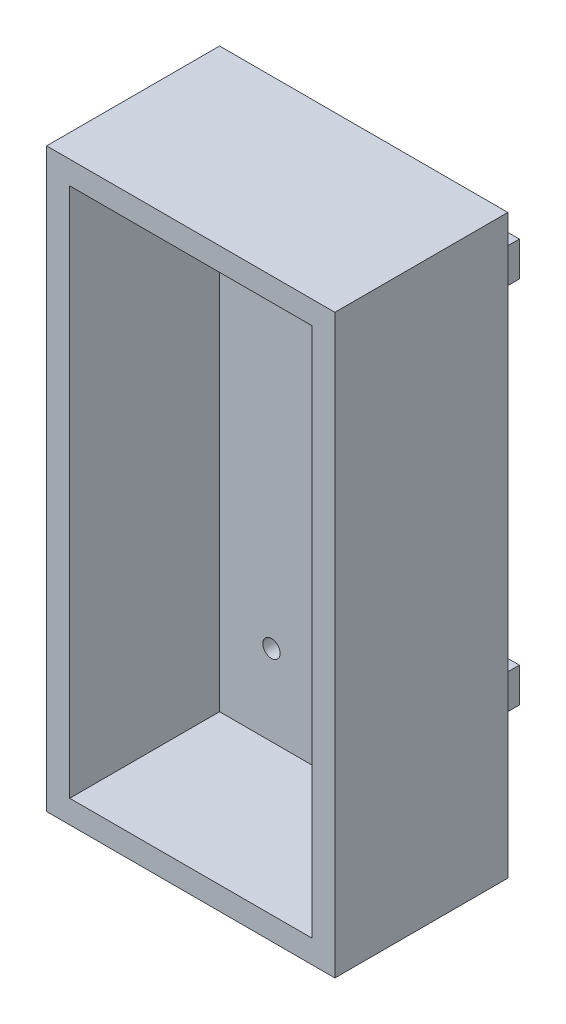
ISO-10303-21;
HEADER;
FILE_DESCRIPTION(('STEP AP214'),'2;1');
FILE_NAME('part.step','',(''),(''),'','','');
FILE_SCHEMA(('AUTOMOTIVE_DESIGN { 1 0 10303 214 1 1 1 1 }'));
ENDSEC;
DATA;
#1=APPLICATION_CONTEXT('core data for automotive mechanical design processes');
#2=APPLICATION_PROTOCOL_DEFINITION('international standard','automotive_design',2000,#1);
#3=PRODUCT_CONTEXT('',#1,'mechanical');
#4=PRODUCT('Part','Part','',(#3));
#5=PRODUCT_RELATED_PRODUCT_CATEGORY('part','',(#4));
#6=PRODUCT_DEFINITION_FORMATION('','',#4);
#7=PRODUCT_DEFINITION_CONTEXT('part definition',#1,'design');
#8=PRODUCT_DEFINITION('design','',#6,#7);
#9=PRODUCT_DEFINITION_SHAPE('','',#8);
#10=(LENGTH_UNIT() NAMED_UNIT(*) SI_UNIT(.MILLI.,.METRE.));
#11=(NAMED_UNIT(*) PLANE_ANGLE_UNIT() SI_UNIT($,.RADIAN.));
#12=(NAMED_UNIT(*) SI_UNIT($,.STERADIAN.) SOLID_ANGLE_UNIT());
#13=UNCERTAINTY_MEASURE_WITH_UNIT(LENGTH_MEASURE(1.E-05),#10,'distance_accuracy_value','');
#14=(GEOMETRIC_REPRESENTATION_CONTEXT(3) GLOBAL_UNCERTAINTY_ASSIGNED_CONTEXT((#13)) GLOBAL_UNIT_ASSIGNED_CONTEXT((#10,
#11,#12)) REPRESENTATION_CONTEXT('',''));
#15=CARTESIAN_POINT('',(0.,0.,0.));
#16=DIRECTION('',(0.,0.,1.));
#17=DIRECTION('',(1.,0.,0.));
#18=AXIS2_PLACEMENT_3D('',#15,#16,#17);
#19=CARTESIAN_POINT('',(0.,0.,0.));
#20=DIRECTION('',(0.,0.,-1.));
#21=DIRECTION('',(-1.,0.,0.));
#22=AXIS2_PLACEMENT_3D('',#19,#20,#21);
#23=PLANE('',#22);
#24=DIRECTION('',(0.,-1.,0.));
#25=VECTOR('',#24,1.);
#26=CARTESIAN_POINT('',(0.,0.,0.));
#27=LINE('',#26,#25);
#28=CARTESIAN_POINT('',(0.,100.,0.));
#29=VERTEX_POINT('',#28);
#30=CARTESIAN_POINT('',(0.,0.,0.));
#31=VERTEX_POINT('',#30);
#32=EDGE_CURVE('E252',#29,#31,#27,.T.);
#33=ORIENTED_EDGE('',*,*,#32,.F.);
#34=DIRECTION('',(-1.,0.,0.));
#35=VECTOR('',#34,1.);
#36=CARTESIAN_POINT('',(0.,100.,0.));
#37=LINE('',#36,#35);
#38=CARTESIAN_POINT('',(50.,100.,0.));
#39=VERTEX_POINT('',#38);
#40=EDGE_CURVE('E263',#39,#29,#37,.T.);
#41=ORIENTED_EDGE('',*,*,#40,.F.);
#42=DIRECTION('',(0.,1.,0.));
#43=VECTOR('',#42,1.);
#44=CARTESIAN_POINT('',(50.,0.,0.));
#45=LINE('',#44,#43);
#46=CARTESIAN_POINT('',(50.,0.,0.));
#47=VERTEX_POINT('',#46);
#48=EDGE_CURVE('E274',#47,#39,#45,.T.);
#49=ORIENTED_EDGE('',*,*,#48,.F.);
#50=DIRECTION('',(1.,0.,0.));
#51=VECTOR('',#50,1.);
#52=CARTESIAN_POINT('',(0.,0.,0.));
#53=LINE('',#52,#51);
#54=EDGE_CURVE('E272',#31,#47,#53,.T.);
#55=ORIENTED_EDGE('',*,*,#54,.F.);
#56=EDGE_LOOP('',(#33,#41,#49,#55));
#57=FACE_BOUND('',#56,.T.);
#58=DIRECTION('',(-1.,0.,0.));
#59=VECTOR('',#58,1.);
#60=CARTESIAN_POINT('',(40.,15.,0.));
#61=LINE('',#60,#59);
#62=CARTESIAN_POINT('',(40.,15.,0.));
#63=VERTEX_POINT('',#62);
#64=CARTESIAN_POINT('',(10.,15.,0.));
#65=VERTEX_POINT('',#64);
#66=EDGE_CURVE('E209',#63,#65,#61,.T.);
#67=ORIENTED_EDGE('',*,*,#66,.F.);
#68=DIRECTION('',(0.,-1.,0.));
#69=VECTOR('',#68,1.);
#70=CARTESIAN_POINT('',(40.,21.,0.));
#71=LINE('',#70,#69);
#72=CARTESIAN_POINT('',(40.,21.,0.));
#73=VERTEX_POINT('',#72);
#74=EDGE_CURVE('E206',#73,#63,#71,.T.);
#75=ORIENTED_EDGE('',*,*,#74,.F.);
#76=DIRECTION('',(1.,0.,0.));
#77=VECTOR('',#76,1.);
#78=CARTESIAN_POINT('',(40.,21.,0.));
#79=LINE('',#78,#77);
#80=CARTESIAN_POINT('',(10.,21.,0.));
#81=VERTEX_POINT('',#80);
#82=EDGE_CURVE('E215',#81,#73,#79,.T.);
#83=ORIENTED_EDGE('',*,*,#82,.F.);
#84=DIRECTION('',(0.,1.,0.));
#85=VECTOR('',#84,1.);
#86=CARTESIAN_POINT('',(10.,21.,0.));
#87=LINE('',#86,#85);
#88=EDGE_CURVE('E212',#65,#81,#87,.T.);
#89=ORIENTED_EDGE('',*,*,#88,.F.);
#90=EDGE_LOOP('',(#67,#75,#83,#89));
#91=FACE_BOUND('',#90,.T.);
#92=DIRECTION('',(-1.,0.,0.));
#93=VECTOR('',#92,1.);
#94=CARTESIAN_POINT('',(40.,79.,0.));
#95=LINE('',#94,#93);
#96=CARTESIAN_POINT('',(40.,79.,0.));
#97=VERTEX_POINT('',#96);
#98=CARTESIAN_POINT('',(10.,79.,0.));
#99=VERTEX_POINT('',#98);
#100=EDGE_CURVE('E306',#97,#99,#95,.T.);
#101=ORIENTED_EDGE('',*,*,#100,.F.);
#102=DIRECTION('',(0.,-1.,0.));
#103=VECTOR('',#102,1.);
#104=CARTESIAN_POINT('',(40.,79.,0.));
#105=LINE('',#104,#103);
#106=CARTESIAN_POINT('',(40.,85.,0.));
#107=VERTEX_POINT('',#106);
#108=EDGE_CURVE('E303',#107,#97,#105,.T.);
#109=ORIENTED_EDGE('',*,*,#108,.F.);
#110=DIRECTION('',(1.,0.,0.));
#111=VECTOR('',#110,1.);
#112=CARTESIAN_POINT('',(40.,85.,0.));
#113=LINE('',#112,#111);
#114=CARTESIAN_POINT('',(10.,85.,0.));
#115=VERTEX_POINT('',#114);
#116=EDGE_CURVE('E201',#115,#107,#113,.T.);
#117=ORIENTED_EDGE('',*,*,#116,.F.);
#118=DIRECTION('',(0.,1.,0.));
#119=VECTOR('',#118,1.);
#120=CARTESIAN_POINT('',(10.,79.,0.));
#121=LINE('',#120,#119);
#122=EDGE_CURVE('E194',#99,#115,#121,.T.);
#123=ORIENTED_EDGE('',*,*,#122,.F.);
#124=EDGE_LOOP('',(#101,#109,#117,#123));
#125=FACE_BOUND('',#124,.T.);
#126=ADVANCED_FACE('F33',(#57,#91,#125),#23,.T.);
#127=CARTESIAN_POINT('',(0.,0.,30.));
#128=DIRECTION('',(1.,0.,0.));
#129=DIRECTION('',(0.,0.,-1.));
#130=AXIS2_PLACEMENT_3D('',#127,#128,#129);
#131=PLANE('',#130);
#132=ORIENTED_EDGE('',*,*,#32,.T.);
#133=DIRECTION('',(0.,0.,-1.));
#134=VECTOR('',#133,1.);
#135=CARTESIAN_POINT('',(0.,0.,30.));
#136=LINE('',#135,#134);
#137=CARTESIAN_POINT('',(0.,0.,30.));
#138=VERTEX_POINT('',#137);
#139=EDGE_CURVE('E11',#138,#31,#136,.T.);
#140=ORIENTED_EDGE('',*,*,#139,.F.);
#141=DIRECTION('',(0.,-1.,0.));
#142=VECTOR('',#141,1.);
#143=CARTESIAN_POINT('',(0.,0.,30.));
#144=LINE('',#143,#142);
#145=CARTESIAN_POINT('',(0.,100.,30.));
#146=VERTEX_POINT('',#145);
#147=EDGE_CURVE('E259',#146,#138,#144,.T.);
#148=ORIENTED_EDGE('',*,*,#147,.F.);
#149=DIRECTION('',(0.,0.,-1.));
#150=VECTOR('',#149,1.);
#151=CARTESIAN_POINT('',(0.,100.,30.));
#152=LINE('',#151,#150);
#153=EDGE_CURVE('E269',#146,#29,#152,.T.);
#154=ORIENTED_EDGE('',*,*,#153,.T.);
#155=EDGE_LOOP('',(#132,#140,#148,#154));
#156=FACE_BOUND('',#155,.T.);
#157=ADVANCED_FACE('F35',(#156),#131,.F.);
#158=CARTESIAN_POINT('',(0.,0.,30.));
#159=DIRECTION('',(0.,1.,0.));
#160=DIRECTION('',(0.,0.,1.));
#161=AXIS2_PLACEMENT_3D('',#158,#159,#160);
#162=PLANE('',#161);
#163=ORIENTED_EDGE('',*,*,#54,.T.);
#164=DIRECTION('',(0.,0.,-1.));
#165=VECTOR('',#164,1.);
#166=CARTESIAN_POINT('',(50.,0.,30.));
#167=LINE('',#166,#165);
#168=CARTESIAN_POINT('',(50.,0.,30.));
#169=VERTEX_POINT('',#168);
#170=EDGE_CURVE('E42',#169,#47,#167,.T.);
#171=ORIENTED_EDGE('',*,*,#170,.F.);
#172=DIRECTION('',(1.,0.,0.));
#173=VECTOR('',#172,1.);
#174=CARTESIAN_POINT('',(0.,0.,30.));
#175=LINE('',#174,#173);
#176=EDGE_CURVE('E262',#138,#169,#175,.T.);
#177=ORIENTED_EDGE('',*,*,#176,.F.);
#178=ORIENTED_EDGE('',*,*,#139,.T.);
#179=EDGE_LOOP('',(#163,#171,#177,#178));
#180=FACE_BOUND('',#179,.T.);
#181=ADVANCED_FACE('F379',(#180),#162,.F.);
#182=CARTESIAN_POINT('',(50.,0.,30.));
#183=DIRECTION('',(-1.,0.,0.));
#184=DIRECTION('',(0.,0.,1.));
#185=AXIS2_PLACEMENT_3D('',#182,#183,#184);
#186=PLANE('',#185);
#187=ORIENTED_EDGE('',*,*,#48,.T.);
#188=DIRECTION('',(0.,0.,-1.));
#189=VECTOR('',#188,1.);
#190=CARTESIAN_POINT('',(50.,100.,30.));
#191=LINE('',#190,#189);
#192=CARTESIAN_POINT('',(50.,100.,30.));
#193=VERTEX_POINT('',#192);
#194=EDGE_CURVE('E279',#193,#39,#191,.T.);
#195=ORIENTED_EDGE('',*,*,#194,.F.);
#196=DIRECTION('',(0.,1.,0.));
#197=VECTOR('',#196,1.);
#198=CARTESIAN_POINT('',(50.,0.,30.));
#199=LINE('',#198,#197);
#200=EDGE_CURVE('E265',#169,#193,#199,.T.);
#201=ORIENTED_EDGE('',*,*,#200,.F.);
#202=ORIENTED_EDGE('',*,*,#170,.T.);
#203=EDGE_LOOP('',(#187,#195,#201,#202));
#204=FACE_BOUND('',#203,.T.);
#205=ADVANCED_FACE('F390',(#204),#186,.F.);
#206=CARTESIAN_POINT('',(0.,100.,30.));
#207=DIRECTION('',(0.,-1.,0.));
#208=DIRECTION('',(0.,0.,-1.));
#209=AXIS2_PLACEMENT_3D('',#206,#207,#208);
#210=PLANE('',#209);
#211=ORIENTED_EDGE('',*,*,#40,.T.);
#212=ORIENTED_EDGE('',*,*,#153,.F.);
#213=DIRECTION('',(-1.,0.,0.));
#214=VECTOR('',#213,1.);
#215=CARTESIAN_POINT('',(0.,100.,30.));
#216=LINE('',#215,#214);
#217=EDGE_CURVE('E267',#193,#146,#216,.T.);
#218=ORIENTED_EDGE('',*,*,#217,.F.);
#219=ORIENTED_EDGE('',*,*,#194,.T.);
#220=EDGE_LOOP('',(#211,#212,#218,#219));
#221=FACE_BOUND('',#220,.T.);
#222=ADVANCED_FACE('F387',(#221),#210,.F.);
#223=CARTESIAN_POINT('',(0.,0.,30.));
#224=DIRECTION('',(0.,0.,-1.));
#225=DIRECTION('',(-1.,0.,0.));
#226=AXIS2_PLACEMENT_3D('',#223,#224,#225);
#227=PLANE('',#226);
#228=DIRECTION('',(1.,0.,0.));
#229=VECTOR('',#228,1.);
#230=CARTESIAN_POINT('',(4.,4.,30.));
#231=LINE('',#230,#229);
#232=CARTESIAN_POINT('',(4.,4.,30.));
#233=VERTEX_POINT('',#232);
#234=CARTESIAN_POINT('',(46.,4.,30.));
#235=VERTEX_POINT('',#234);
#236=EDGE_CURVE('E242',#233,#235,#231,.T.);
#237=ORIENTED_EDGE('',*,*,#236,.F.);
#238=DIRECTION('',(0.,-1.,0.));
#239=VECTOR('',#238,1.);
#240=CARTESIAN_POINT('',(4.,4.,30.));
#241=LINE('',#240,#239);
#242=CARTESIAN_POINT('',(4.,96.,30.));
#243=VERTEX_POINT('',#242);
#244=EDGE_CURVE('E226',#243,#233,#241,.T.);
#245=ORIENTED_EDGE('',*,*,#244,.F.);
#246=DIRECTION('',(-1.,0.,0.));
#247=VECTOR('',#246,1.);
#248=CARTESIAN_POINT('',(4.,96.,30.));
#249=LINE('',#248,#247);
#250=CARTESIAN_POINT('',(46.,96.,30.));
#251=VERTEX_POINT('',#250);
#252=EDGE_CURVE('E231',#251,#243,#249,.T.);
#253=ORIENTED_EDGE('',*,*,#252,.F.);
#254=DIRECTION('',(0.,1.,0.));
#255=VECTOR('',#254,1.);
#256=CARTESIAN_POINT('',(46.,4.,30.));
#257=LINE('',#256,#255);
#258=EDGE_CURVE('E245',#235,#251,#257,.T.);
#259=ORIENTED_EDGE('',*,*,#258,.F.);
#260=EDGE_LOOP('',(#237,#245,#253,#259));
#261=FACE_BOUND('',#260,.T.);
#262=ORIENTED_EDGE('',*,*,#147,.T.);
#263=ORIENTED_EDGE('',*,*,#176,.T.);
#264=ORIENTED_EDGE('',*,*,#200,.T.);
#265=ORIENTED_EDGE('',*,*,#217,.T.);
#266=EDGE_LOOP('',(#262,#263,#264,#265));
#267=FACE_BOUND('',#266,.T.);
#268=ADVANCED_FACE('F385',(#261,#267),#227,.F.);
#269=CARTESIAN_POINT('',(4.,4.,4.));
#270=DIRECTION('',(-1.,0.,0.));
#271=DIRECTION('',(0.,0.,1.));
#272=AXIS2_PLACEMENT_3D('',#269,#270,#271);
#273=PLANE('',#272);
#274=ORIENTED_EDGE('',*,*,#244,.T.);
#275=DIRECTION('',(0.,0.,1.));
#276=VECTOR('',#275,1.);
#277=CARTESIAN_POINT('',(4.,4.,4.));
#278=LINE('',#277,#276);
#279=CARTESIAN_POINT('',(4.,4.,4.));
#280=VERTEX_POINT('',#279);
#281=EDGE_CURVE('E240',#280,#233,#278,.T.);
#282=ORIENTED_EDGE('',*,*,#281,.F.);
#283=DIRECTION('',(0.,-1.,0.));
#284=VECTOR('',#283,1.);
#285=CARTESIAN_POINT('',(4.,4.,4.));
#286=LINE('',#285,#284);
#287=CARTESIAN_POINT('',(4.,96.,4.));
#288=VERTEX_POINT('',#287);
#289=EDGE_CURVE('E227',#288,#280,#286,.T.);
#290=ORIENTED_EDGE('',*,*,#289,.F.);
#291=DIRECTION('',(0.,0.,1.));
#292=VECTOR('',#291,1.);
#293=CARTESIAN_POINT('',(4.,96.,4.));
#294=LINE('',#293,#292);
#295=EDGE_CURVE('E250',#288,#243,#294,.T.);
#296=ORIENTED_EDGE('',*,*,#295,.T.);
#297=EDGE_LOOP('',(#274,#282,#290,#296));
#298=FACE_BOUND('',#297,.T.);
#299=ADVANCED_FACE('F409',(#298),#273,.F.);
#300=CARTESIAN_POINT('',(4.,96.,4.));
#301=DIRECTION('',(0.,1.,0.));
#302=DIRECTION('',(0.,0.,1.));
#303=AXIS2_PLACEMENT_3D('',#300,#301,#302);
#304=PLANE('',#303);
#305=ORIENTED_EDGE('',*,*,#252,.T.);
#306=ORIENTED_EDGE('',*,*,#295,.F.);
#307=DIRECTION('',(-1.,0.,0.));
#308=VECTOR('',#307,1.);
#309=CARTESIAN_POINT('',(4.,96.,4.));
#310=LINE('',#309,#308);
#311=CARTESIAN_POINT('',(46.,96.,4.));
#312=VERTEX_POINT('',#311);
#313=EDGE_CURVE('E237',#312,#288,#310,.T.);
#314=ORIENTED_EDGE('',*,*,#313,.F.);
#315=DIRECTION('',(0.,0.,1.));
#316=VECTOR('',#315,1.);
#317=CARTESIAN_POINT('',(46.,96.,4.));
#318=LINE('',#317,#316);
#319=EDGE_CURVE('E253',#312,#251,#318,.T.);
#320=ORIENTED_EDGE('',*,*,#319,.T.);
#321=EDGE_LOOP('',(#305,#306,#314,#320));
#322=FACE_BOUND('',#321,.T.);
#323=ADVANCED_FACE('F414',(#322),#304,.F.);
#324=CARTESIAN_POINT('',(46.,4.,4.));
#325=DIRECTION('',(1.,0.,0.));
#326=DIRECTION('',(0.,0.,-1.));
#327=AXIS2_PLACEMENT_3D('',#324,#325,#326);
#328=PLANE('',#327);
#329=ORIENTED_EDGE('',*,*,#258,.T.);
#330=ORIENTED_EDGE('',*,*,#319,.F.);
#331=DIRECTION('',(0.,1.,0.));
#332=VECTOR('',#331,1.);
#333=CARTESIAN_POINT('',(46.,4.,4.));
#334=LINE('',#333,#332);
#335=CARTESIAN_POINT('',(46.,4.,4.));
#336=VERTEX_POINT('',#335);
#337=EDGE_CURVE('E234',#336,#312,#334,.T.);
#338=ORIENTED_EDGE('',*,*,#337,.F.);
#339=DIRECTION('',(0.,0.,1.));
#340=VECTOR('',#339,1.);
#341=CARTESIAN_POINT('',(46.,4.,4.));
#342=LINE('',#341,#340);
#343=EDGE_CURVE('E255',#336,#235,#342,.T.);
#344=ORIENTED_EDGE('',*,*,#343,.T.);
#345=EDGE_LOOP('',(#329,#330,#338,#344));
#346=FACE_BOUND('',#345,.T.);
#347=ADVANCED_FACE('F428',(#346),#328,.F.);
#348=CARTESIAN_POINT('',(4.,4.,4.));
#349=DIRECTION('',(0.,-1.,0.));
#350=DIRECTION('',(0.,0.,-1.));
#351=AXIS2_PLACEMENT_3D('',#348,#349,#350);
#352=PLANE('',#351);
#353=ORIENTED_EDGE('',*,*,#236,.T.);
#354=ORIENTED_EDGE('',*,*,#343,.F.);
#355=DIRECTION('',(1.,0.,0.));
#356=VECTOR('',#355,1.);
#357=CARTESIAN_POINT('',(4.,4.,4.));
#358=LINE('',#357,#356);
#359=EDGE_CURVE('E230',#280,#336,#358,.T.);
#360=ORIENTED_EDGE('',*,*,#359,.F.);
#361=ORIENTED_EDGE('',*,*,#281,.T.);
#362=EDGE_LOOP('',(#353,#354,#360,#361));
#363=FACE_BOUND('',#362,.T.);
#364=ADVANCED_FACE('F421',(#363),#352,.F.);
#365=CARTESIAN_POINT('',(0.,0.,4.));
#366=DIRECTION('',(0.,0.,-1.));
#367=DIRECTION('',(-1.,0.,0.));
#368=AXIS2_PLACEMENT_3D('',#365,#366,#367);
#369=PLANE('',#368);
#370=CARTESIAN_POINT('',(37.,18.,4.));
#371=DIRECTION('',(0.,0.,-1.));
#372=DIRECTION('',(-1.,0.,0.));
#373=AXIS2_PLACEMENT_3D('',#370,#371,#372);
#374=CIRCLE('',#373,1.5);
#375=CARTESIAN_POINT('',(35.5,18.,4.));
#376=VERTEX_POINT('',#375);
#377=EDGE_CURVE('E284',#376,#376,#374,.T.);
#378=ORIENTED_EDGE('',*,*,#377,.T.);
#379=EDGE_LOOP('',(#378));
#380=FACE_BOUND('',#379,.T.);
#381=CARTESIAN_POINT('',(13.,82.,4.));
#382=DIRECTION('',(0.,0.,-1.));
#383=DIRECTION('',(-1.,0.,0.));
#384=AXIS2_PLACEMENT_3D('',#381,#382,#383);
#385=CIRCLE('',#384,1.5);
#386=CARTESIAN_POINT('',(11.5,82.,4.));
#387=VERTEX_POINT('',#386);
#388=EDGE_CURVE('E294',#387,#387,#385,.T.);
#389=ORIENTED_EDGE('',*,*,#388,.T.);
#390=EDGE_LOOP('',(#389));
#391=FACE_BOUND('',#390,.T.);
#392=CARTESIAN_POINT('',(37.,82.,4.));
#393=DIRECTION('',(0.,0.,-1.));
#394=DIRECTION('',(-1.,0.,0.));
#395=AXIS2_PLACEMENT_3D('',#392,#393,#394);
#396=CIRCLE('',#395,1.5);
#397=CARTESIAN_POINT('',(35.5,82.,4.));
#398=VERTEX_POINT('',#397);
#399=EDGE_CURVE('E348',#398,#398,#396,.T.);
#400=ORIENTED_EDGE('',*,*,#399,.T.);
#401=EDGE_LOOP('',(#400));
#402=FACE_BOUND('',#401,.T.);
#403=CARTESIAN_POINT('',(13.,18.,4.));
#404=DIRECTION('',(0.,0.,-1.));
#405=DIRECTION('',(-1.,0.,0.));
#406=AXIS2_PLACEMENT_3D('',#403,#404,#405);
#407=CIRCLE('',#406,1.5);
#408=CARTESIAN_POINT('',(11.5,18.,4.));
#409=VERTEX_POINT('',#408);
#410=EDGE_CURVE('E289',#409,#409,#407,.T.);
#411=ORIENTED_EDGE('',*,*,#410,.T.);
#412=EDGE_LOOP('',(#411));
#413=FACE_BOUND('',#412,.T.);
#414=ORIENTED_EDGE('',*,*,#289,.T.);
#415=ORIENTED_EDGE('',*,*,#359,.T.);
#416=ORIENTED_EDGE('',*,*,#337,.T.);
#417=ORIENTED_EDGE('',*,*,#313,.T.);
#418=EDGE_LOOP('',(#414,#415,#416,#417));
#419=FACE_BOUND('',#418,.T.);
#420=ADVANCED_FACE('F353',(#380,#391,#402,#413,#419),#369,.F.);
#421=CARTESIAN_POINT('',(40.,21.,-24.));
#422=DIRECTION('',(-1.,0.,0.));
#423=DIRECTION('',(0.,0.,1.));
#424=AXIS2_PLACEMENT_3D('',#421,#422,#423);
#425=PLANE('',#424);
#426=DIRECTION('',(0.,0.,1.));
#427=VECTOR('',#426,1.);
#428=CARTESIAN_POINT('',(40.,15.,-24.));
#429=LINE('',#428,#427);
#430=CARTESIAN_POINT('',(40.,15.,-12.));
#431=VERTEX_POINT('',#430);
#432=EDGE_CURVE('E224',#431,#63,#429,.T.);
#433=ORIENTED_EDGE('',*,*,#432,.F.);
#434=DIRECTION('',(0.,-1.,0.));
#435=VECTOR('',#434,1.);
#436=CARTESIAN_POINT('',(40.,100.,-12.));
#437=LINE('',#436,#435);
#438=CARTESIAN_POINT('',(40.,21.,-12.));
#439=VERTEX_POINT('',#438);
#440=EDGE_CURVE('E317',#439,#431,#437,.T.);
#441=ORIENTED_EDGE('',*,*,#440,.F.);
#442=DIRECTION('',(0.,0.,1.));
#443=VECTOR('',#442,1.);
#444=CARTESIAN_POINT('',(40.,21.,-24.));
#445=LINE('',#444,#443);
#446=EDGE_CURVE('E218',#439,#73,#445,.T.);
#447=ORIENTED_EDGE('',*,*,#446,.T.);
#448=ORIENTED_EDGE('',*,*,#74,.T.);
#449=EDGE_LOOP('',(#433,#441,#447,#448));
#450=FACE_BOUND('',#449,.T.);
#451=ADVANCED_FACE('F431',(#450),#425,.F.);
#452=CARTESIAN_POINT('',(40.,15.,-24.));
#453=DIRECTION('',(0.,1.,0.));
#454=DIRECTION('',(-1.,0.,0.));
#455=AXIS2_PLACEMENT_3D('',#452,#453,#454);
#456=PLANE('',#455);
#457=DIRECTION('',(0.,0.,1.));
#458=VECTOR('',#457,1.);
#459=CARTESIAN_POINT('',(10.,15.,-24.));
#460=LINE('',#459,#458);
#461=CARTESIAN_POINT('',(10.,15.,-12.));
#462=VERTEX_POINT('',#461);
#463=EDGE_CURVE('E222',#462,#65,#460,.T.);
#464=ORIENTED_EDGE('',*,*,#463,.F.);
#465=DIRECTION('',(1.,0.,0.));
#466=VECTOR('',#465,1.);
#467=CARTESIAN_POINT('',(40.,15.,-12.));
#468=LINE('',#467,#466);
#469=CARTESIAN_POINT('',(16.,15.,-12.));
#470=VERTEX_POINT('',#469);
#471=EDGE_CURVE('E341',#462,#470,#468,.T.);
#472=ORIENTED_EDGE('',*,*,#471,.T.);
#473=CARTESIAN_POINT('',(25.,15.,-12.));
#474=DIRECTION('',(0.,1.,0.));
#475=DIRECTION('',(-1.,0.,0.));
#476=AXIS2_PLACEMENT_3D('',#473,#474,#475);
#477=CIRCLE('',#476,9.);
#478=CARTESIAN_POINT('',(34.,15.,-12.));
#479=VERTEX_POINT('',#478);
#480=EDGE_CURVE('E300',#470,#479,#477,.T.);
#481=ORIENTED_EDGE('',*,*,#480,.T.);
#482=EDGE_CURVE('E336',#479,#431,#468,.T.);
#483=ORIENTED_EDGE('',*,*,#482,.T.);
#484=ORIENTED_EDGE('',*,*,#432,.T.);
#485=ORIENTED_EDGE('',*,*,#66,.T.);
#486=EDGE_LOOP('',(#464,#472,#481,#483,#484,#485));
#487=FACE_BOUND('',#486,.T.);
#488=ADVANCED_FACE('F436',(#487),#456,.F.);
#489=CARTESIAN_POINT('',(10.,21.,-24.));
#490=DIRECTION('',(1.,0.,0.));
#491=DIRECTION('',(0.,0.,-1.));
#492=AXIS2_PLACEMENT_3D('',#489,#490,#491);
#493=PLANE('',#492);
#494=DIRECTION('',(0.,0.,1.));
#495=VECTOR('',#494,1.);
#496=CARTESIAN_POINT('',(10.,21.,-24.));
#497=LINE('',#496,#495);
#498=CARTESIAN_POINT('',(10.,21.,-12.));
#499=VERTEX_POINT('',#498);
#500=EDGE_CURVE('E220',#499,#81,#497,.T.);
#501=ORIENTED_EDGE('',*,*,#500,.F.);
#502=DIRECTION('',(0.,-1.,0.));
#503=VECTOR('',#502,1.);
#504=CARTESIAN_POINT('',(10.,100.,-12.));
#505=LINE('',#504,#503);
#506=EDGE_CURVE('E177',#499,#462,#505,.T.);
#507=ORIENTED_EDGE('',*,*,#506,.T.);
#508=ORIENTED_EDGE('',*,*,#463,.T.);
#509=ORIENTED_EDGE('',*,*,#88,.T.);
#510=EDGE_LOOP('',(#501,#507,#508,#509));
#511=FACE_BOUND('',#510,.T.);
#512=ADVANCED_FACE('F472',(#511),#493,.F.);
#513=CARTESIAN_POINT('',(40.,21.,-24.));
#514=DIRECTION('',(0.,-1.,0.));
#515=DIRECTION('',(1.,0.,0.));
#516=AXIS2_PLACEMENT_3D('',#513,#514,#515);
#517=PLANE('',#516);
#518=ORIENTED_EDGE('',*,*,#446,.F.);
#519=DIRECTION('',(-1.,0.,0.));
#520=VECTOR('',#519,1.);
#521=CARTESIAN_POINT('',(40.,21.,-12.));
#522=LINE('',#521,#520);
#523=CARTESIAN_POINT('',(34.,21.,-12.));
#524=VERTEX_POINT('',#523);
#525=EDGE_CURVE('E333',#439,#524,#522,.T.);
#526=ORIENTED_EDGE('',*,*,#525,.T.);
#527=CARTESIAN_POINT('',(25.,21.,-12.));
#528=DIRECTION('',(0.,-1.,0.));
#529=DIRECTION('',(1.,0.,0.));
#530=AXIS2_PLACEMENT_3D('',#527,#528,#529);
#531=CIRCLE('',#530,9.);
#532=CARTESIAN_POINT('',(16.,21.,-12.));
#533=VERTEX_POINT('',#532);
#534=EDGE_CURVE('E286',#524,#533,#531,.T.);
#535=ORIENTED_EDGE('',*,*,#534,.T.);
#536=EDGE_CURVE('E337',#533,#499,#522,.T.);
#537=ORIENTED_EDGE('',*,*,#536,.T.);
#538=ORIENTED_EDGE('',*,*,#500,.T.);
#539=ORIENTED_EDGE('',*,*,#82,.T.);
#540=EDGE_LOOP('',(#518,#526,#535,#537,#538,#539));
#541=FACE_BOUND('',#540,.T.);
#542=ADVANCED_FACE('F481',(#541),#517,.F.);
#543=CARTESIAN_POINT('',(40.,79.,-24.));
#544=DIRECTION('',(-1.,0.,0.));
#545=DIRECTION('',(0.,0.,1.));
#546=AXIS2_PLACEMENT_3D('',#543,#544,#545);
#547=PLANE('',#546);
#548=DIRECTION('',(0.,0.,1.));
#549=VECTOR('',#548,1.);
#550=CARTESIAN_POINT('',(40.,79.,-24.));
#551=LINE('',#550,#549);
#552=CARTESIAN_POINT('',(40.,79.,-12.));
#553=VERTEX_POINT('',#552);
#554=EDGE_CURVE('E199',#553,#97,#551,.T.);
#555=ORIENTED_EDGE('',*,*,#554,.F.);
#556=CARTESIAN_POINT('',(40.,85.,-12.));
#557=VERTEX_POINT('',#556);
#558=EDGE_CURVE('E316',#557,#553,#437,.T.);
#559=ORIENTED_EDGE('',*,*,#558,.F.);
#560=DIRECTION('',(0.,0.,1.));
#561=VECTOR('',#560,1.);
#562=CARTESIAN_POINT('',(40.,85.,-24.));
#563=LINE('',#562,#561);
#564=EDGE_CURVE('E197',#557,#107,#563,.T.);
#565=ORIENTED_EDGE('',*,*,#564,.T.);
#566=ORIENTED_EDGE('',*,*,#108,.T.);
#567=EDGE_LOOP('',(#555,#559,#565,#566));
#568=FACE_BOUND('',#567,.T.);
#569=ADVANCED_FACE('F314',(#568),#547,.F.);
#570=CARTESIAN_POINT('',(40.,79.,-24.));
#571=DIRECTION('',(0.,1.,0.));
#572=DIRECTION('',(-1.,0.,0.));
#573=AXIS2_PLACEMENT_3D('',#570,#571,#572);
#574=PLANE('',#573);
#575=DIRECTION('',(0.,0.,1.));
#576=VECTOR('',#575,1.);
#577=CARTESIAN_POINT('',(10.,79.,-24.));
#578=LINE('',#577,#576);
#579=CARTESIAN_POINT('',(10.,79.,-12.));
#580=VERTEX_POINT('',#579);
#581=EDGE_CURVE('E196',#580,#99,#578,.T.);
#582=ORIENTED_EDGE('',*,*,#581,.F.);
#583=DIRECTION('',(1.,0.,0.));
#584=VECTOR('',#583,1.);
#585=CARTESIAN_POINT('',(40.,79.,-12.));
#586=LINE('',#585,#584);
#587=CARTESIAN_POINT('',(16.,79.,-12.));
#588=VERTEX_POINT('',#587);
#589=EDGE_CURVE('E173',#580,#588,#586,.T.);
#590=ORIENTED_EDGE('',*,*,#589,.T.);
#591=CARTESIAN_POINT('',(25.,79.,-12.));
#592=DIRECTION('',(0.,1.,0.));
#593=DIRECTION('',(-1.,0.,0.));
#594=AXIS2_PLACEMENT_3D('',#591,#592,#593);
#595=CIRCLE('',#594,9.);
#596=CARTESIAN_POINT('',(34.,79.,-12.));
#597=VERTEX_POINT('',#596);
#598=EDGE_CURVE('E283',#588,#597,#595,.T.);
#599=ORIENTED_EDGE('',*,*,#598,.T.);
#600=EDGE_CURVE('E50',#597,#553,#586,.T.);
#601=ORIENTED_EDGE('',*,*,#600,.T.);
#602=ORIENTED_EDGE('',*,*,#554,.T.);
#603=ORIENTED_EDGE('',*,*,#100,.T.);
#604=EDGE_LOOP('',(#582,#590,#599,#601,#602,#603));
#605=FACE_BOUND('',#604,.T.);
#606=ADVANCED_FACE('F500',(#605),#574,.F.);
#607=CARTESIAN_POINT('',(10.,79.,-24.));
#608=DIRECTION('',(1.,0.,0.));
#609=DIRECTION('',(0.,0.,-1.));
#610=AXIS2_PLACEMENT_3D('',#607,#608,#609);
#611=PLANE('',#610);
#612=DIRECTION('',(0.,0.,1.));
#613=VECTOR('',#612,1.);
#614=CARTESIAN_POINT('',(10.,85.,-24.));
#615=LINE('',#614,#613);
#616=CARTESIAN_POINT('',(10.,85.,-12.));
#617=VERTEX_POINT('',#616);
#618=EDGE_CURVE('E184',#617,#115,#615,.T.);
#619=ORIENTED_EDGE('',*,*,#618,.F.);
#620=EDGE_CURVE('E170',#617,#580,#505,.T.);
#621=ORIENTED_EDGE('',*,*,#620,.T.);
#622=ORIENTED_EDGE('',*,*,#581,.T.);
#623=ORIENTED_EDGE('',*,*,#122,.T.);
#624=EDGE_LOOP('',(#619,#621,#622,#623));
#625=FACE_BOUND('',#624,.T.);
#626=ADVANCED_FACE('F192',(#625),#611,.F.);
#627=CARTESIAN_POINT('',(40.,85.,-24.));
#628=DIRECTION('',(0.,-1.,0.));
#629=DIRECTION('',(1.,0.,0.));
#630=AXIS2_PLACEMENT_3D('',#627,#628,#629);
#631=PLANE('',#630);
#632=ORIENTED_EDGE('',*,*,#564,.F.);
#633=DIRECTION('',(-1.,0.,0.));
#634=VECTOR('',#633,1.);
#635=CARTESIAN_POINT('',(40.,85.,-12.));
#636=LINE('',#635,#634);
#637=CARTESIAN_POINT('',(34.,85.,-12.));
#638=VERTEX_POINT('',#637);
#639=EDGE_CURVE('E191',#557,#638,#636,.T.);
#640=ORIENTED_EDGE('',*,*,#639,.T.);
#641=CARTESIAN_POINT('',(25.,85.,-12.));
#642=DIRECTION('',(0.,-1.,0.));
#643=DIRECTION('',(1.,0.,0.));
#644=AXIS2_PLACEMENT_3D('',#641,#642,#643);
#645=CIRCLE('',#644,9.);
#646=CARTESIAN_POINT('',(16.,85.,-12.));
#647=VERTEX_POINT('',#646);
#648=EDGE_CURVE('E188',#638,#647,#645,.T.);
#649=ORIENTED_EDGE('',*,*,#648,.T.);
#650=EDGE_CURVE('E58',#647,#617,#636,.T.);
#651=ORIENTED_EDGE('',*,*,#650,.T.);
#652=ORIENTED_EDGE('',*,*,#618,.T.);
#653=ORIENTED_EDGE('',*,*,#116,.T.);
#654=EDGE_LOOP('',(#632,#640,#649,#651,#652,#653));
#655=FACE_BOUND('',#654,.T.);
#656=ADVANCED_FACE('F182',(#655),#631,.F.);
#657=CARTESIAN_POINT('',(25.,100.,-12.));
#658=DIRECTION('',(0.,-1.,0.));
#659=DIRECTION('',(1.,0.,0.));
#660=AXIS2_PLACEMENT_3D('',#657,#658,#659);
#661=CYLINDRICAL_SURFACE('',#660,9.);
#662=ORIENTED_EDGE('',*,*,#598,.F.);
#663=DIRECTION('',(0.,-1.,0.));
#664=VECTOR('',#663,1.);
#665=CARTESIAN_POINT('',(16.,100.,-12.));
#666=LINE('',#665,#664);
#667=EDGE_CURVE('E189',#588,#647,#666,.F.);
#668=ORIENTED_EDGE('',*,*,#667,.T.);
#669=ORIENTED_EDGE('',*,*,#648,.F.);
#670=DIRECTION('',(0.,-1.,0.));
#671=VECTOR('',#670,1.);
#672=CARTESIAN_POINT('',(34.,100.,-12.));
#673=LINE('',#672,#671);
#674=EDGE_CURVE('E344',#638,#597,#673,.T.);
#675=ORIENTED_EDGE('',*,*,#674,.T.);
#676=EDGE_LOOP('',(#662,#668,#669,#675));
#677=FACE_BOUND('',#676,.T.);
#678=ADVANCED_FACE('F526',(#677),#661,.F.);
#679=ORIENTED_EDGE('',*,*,#480,.F.);
#680=DIRECTION('',(0.,-1.,0.));
#681=VECTOR('',#680,1.);
#682=CARTESIAN_POINT('',(16.,100.,-12.));
#683=LINE('',#682,#681);
#684=EDGE_CURVE('E340',#470,#533,#683,.F.);
#685=ORIENTED_EDGE('',*,*,#684,.T.);
#686=ORIENTED_EDGE('',*,*,#534,.F.);
#687=DIRECTION('',(0.,-1.,0.));
#688=VECTOR('',#687,1.);
#689=CARTESIAN_POINT('',(34.,100.,-12.));
#690=LINE('',#689,#688);
#691=EDGE_CURVE('E330',#524,#479,#690,.T.);
#692=ORIENTED_EDGE('',*,*,#691,.T.);
#693=EDGE_LOOP('',(#679,#685,#686,#692));
#694=FACE_BOUND('',#693,.T.);
#695=ADVANCED_FACE('F369',(#694),#661,.F.);
#696=CARTESIAN_POINT('',(37.,82.,30.));
#697=DIRECTION('',(0.,0.,-1.));
#698=DIRECTION('',(-1.,0.,0.));
#699=AXIS2_PLACEMENT_3D('',#696,#697,#698);
#700=CYLINDRICAL_SURFACE('',#699,1.5);
#701=CARTESIAN_POINT('',(37.,82.,-12.));
#702=DIRECTION('',(0.,0.,1.));
#703=DIRECTION('',(1.,0.,0.));
#704=AXIS2_PLACEMENT_3D('',#701,#702,#703);
#705=CIRCLE('',#704,1.5);
#706=CARTESIAN_POINT('',(38.5,82.,-12.));
#707=VERTEX_POINT('',#706);
#708=EDGE_CURVE('E327',#707,#707,#705,.F.);
#709=ORIENTED_EDGE('',*,*,#708,.T.);
#710=EDGE_LOOP('',(#709));
#711=FACE_BOUND('',#710,.T.);
#712=ORIENTED_EDGE('',*,*,#399,.F.);
#713=EDGE_LOOP('',(#712));
#714=FACE_BOUND('',#713,.T.);
#715=ADVANCED_FACE('F359',(#711,#714),#700,.F.);
#716=CARTESIAN_POINT('',(13.,82.,30.));
#717=DIRECTION('',(0.,0.,-1.));
#718=DIRECTION('',(-1.,0.,0.));
#719=AXIS2_PLACEMENT_3D('',#716,#717,#718);
#720=CYLINDRICAL_SURFACE('',#719,1.5);
#721=CARTESIAN_POINT('',(13.,82.,-12.));
#722=DIRECTION('',(0.,0.,1.));
#723=DIRECTION('',(1.,0.,0.));
#724=AXIS2_PLACEMENT_3D('',#721,#722,#723);
#725=CIRCLE('',#724,1.5);
#726=CARTESIAN_POINT('',(14.5,82.,-12.));
#727=VERTEX_POINT('',#726);
#728=EDGE_CURVE('E324',#727,#727,#725,.F.);
#729=ORIENTED_EDGE('',*,*,#728,.T.);
#730=EDGE_LOOP('',(#729));
#731=FACE_BOUND('',#730,.T.);
#732=ORIENTED_EDGE('',*,*,#388,.F.);
#733=EDGE_LOOP('',(#732));
#734=FACE_BOUND('',#733,.T.);
#735=ADVANCED_FACE('F356',(#731,#734),#720,.F.);
#736=CARTESIAN_POINT('',(13.,18.,30.));
#737=DIRECTION('',(0.,0.,-1.));
#738=DIRECTION('',(-1.,0.,0.));
#739=AXIS2_PLACEMENT_3D('',#736,#737,#738);
#740=CYLINDRICAL_SURFACE('',#739,1.5);
#741=CARTESIAN_POINT('',(13.,18.,-12.));
#742=DIRECTION('',(0.,0.,1.));
#743=DIRECTION('',(1.,0.,0.));
#744=AXIS2_PLACEMENT_3D('',#741,#742,#743);
#745=CIRCLE('',#744,1.5);
#746=CARTESIAN_POINT('',(14.5,18.,-12.));
#747=VERTEX_POINT('',#746);
#748=EDGE_CURVE('E321',#747,#747,#745,.F.);
#749=ORIENTED_EDGE('',*,*,#748,.T.);
#750=EDGE_LOOP('',(#749));
#751=FACE_BOUND('',#750,.T.);
#752=ORIENTED_EDGE('',*,*,#410,.F.);
#753=EDGE_LOOP('',(#752));
#754=FACE_BOUND('',#753,.T.);
#755=ADVANCED_FACE('F358',(#751,#754),#740,.F.);
#756=CARTESIAN_POINT('',(37.,18.,30.));
#757=DIRECTION('',(0.,0.,-1.));
#758=DIRECTION('',(-1.,0.,0.));
#759=AXIS2_PLACEMENT_3D('',#756,#757,#758);
#760=CYLINDRICAL_SURFACE('',#759,1.5);
#761=CARTESIAN_POINT('',(37.,18.,-12.));
#762=DIRECTION('',(0.,0.,1.));
#763=DIRECTION('',(1.,0.,0.));
#764=AXIS2_PLACEMENT_3D('',#761,#762,#763);
#765=CIRCLE('',#764,1.5);
#766=CARTESIAN_POINT('',(38.5,18.,-12.));
#767=VERTEX_POINT('',#766);
#768=EDGE_CURVE('E37',#767,#767,#765,.F.);
#769=ORIENTED_EDGE('',*,*,#768,.T.);
#770=EDGE_LOOP('',(#769));
#771=FACE_BOUND('',#770,.T.);
#772=ORIENTED_EDGE('',*,*,#377,.F.);
#773=EDGE_LOOP('',(#772));
#774=FACE_BOUND('',#773,.T.);
#775=ADVANCED_FACE('F366',(#771,#774),#760,.F.);
#776=CARTESIAN_POINT('',(10.,100.,-12.));
#777=DIRECTION('',(0.,0.,1.));
#778=DIRECTION('',(1.,0.,0.));
#779=AXIS2_PLACEMENT_3D('',#776,#777,#778);
#780=PLANE('',#779);
#781=ORIENTED_EDGE('',*,*,#768,.F.);
#782=EDGE_LOOP('',(#781));
#783=FACE_BOUND('',#782,.T.);
#784=ORIENTED_EDGE('',*,*,#691,.F.);
#785=ORIENTED_EDGE('',*,*,#525,.F.);
#786=ORIENTED_EDGE('',*,*,#440,.T.);
#787=ORIENTED_EDGE('',*,*,#482,.F.);
#788=EDGE_LOOP('',(#784,#785,#786,#787));
#789=FACE_BOUND('',#788,.T.);
#790=ADVANCED_FACE('F568',(#783,#789),#780,.F.);
#791=ORIENTED_EDGE('',*,*,#748,.F.);
#792=EDGE_LOOP('',(#791));
#793=FACE_BOUND('',#792,.T.);
#794=ORIENTED_EDGE('',*,*,#506,.F.);
#795=ORIENTED_EDGE('',*,*,#536,.F.);
#796=ORIENTED_EDGE('',*,*,#684,.F.);
#797=ORIENTED_EDGE('',*,*,#471,.F.);
#798=EDGE_LOOP('',(#794,#795,#796,#797));
#799=FACE_BOUND('',#798,.T.);
#800=ADVANCED_FACE('F577',(#793,#799),#780,.F.);
#801=ORIENTED_EDGE('',*,*,#728,.F.);
#802=EDGE_LOOP('',(#801));
#803=FACE_BOUND('',#802,.T.);
#804=ORIENTED_EDGE('',*,*,#620,.F.);
#805=ORIENTED_EDGE('',*,*,#650,.F.);
#806=ORIENTED_EDGE('',*,*,#667,.F.);
#807=ORIENTED_EDGE('',*,*,#589,.F.);
#808=EDGE_LOOP('',(#804,#805,#806,#807));
#809=FACE_BOUND('',#808,.T.);
#810=ADVANCED_FACE('F171',(#803,#809),#780,.F.);
#811=ORIENTED_EDGE('',*,*,#708,.F.);
#812=EDGE_LOOP('',(#811));
#813=FACE_BOUND('',#812,.T.);
#814=ORIENTED_EDGE('',*,*,#674,.F.);
#815=ORIENTED_EDGE('',*,*,#639,.F.);
#816=ORIENTED_EDGE('',*,*,#558,.T.);
#817=ORIENTED_EDGE('',*,*,#600,.F.);
#818=EDGE_LOOP('',(#814,#815,#816,#817));
#819=FACE_BOUND('',#818,.T.);
#820=ADVANCED_FACE('F585',(#813,#819),#780,.F.);
#821=CLOSED_SHELL('',(#126,#157,#181,#205,#222,#268,#299,#323,#347,#364,#420,#451,#488,#512,
#542,#569,#606,#626,#656,#678,#695,#715,#735,#755,#775,#790,#800,#810,#820));
#822=MANIFOLD_SOLID_BREP('B2',#821);
#823=ADVANCED_BREP_SHAPE_REPRESENTATION('',(#18,#822),#14);
#824=SHAPE_DEFINITION_REPRESENTATION(#9,#823);
ENDSEC;
END-ISO-10303-21;
